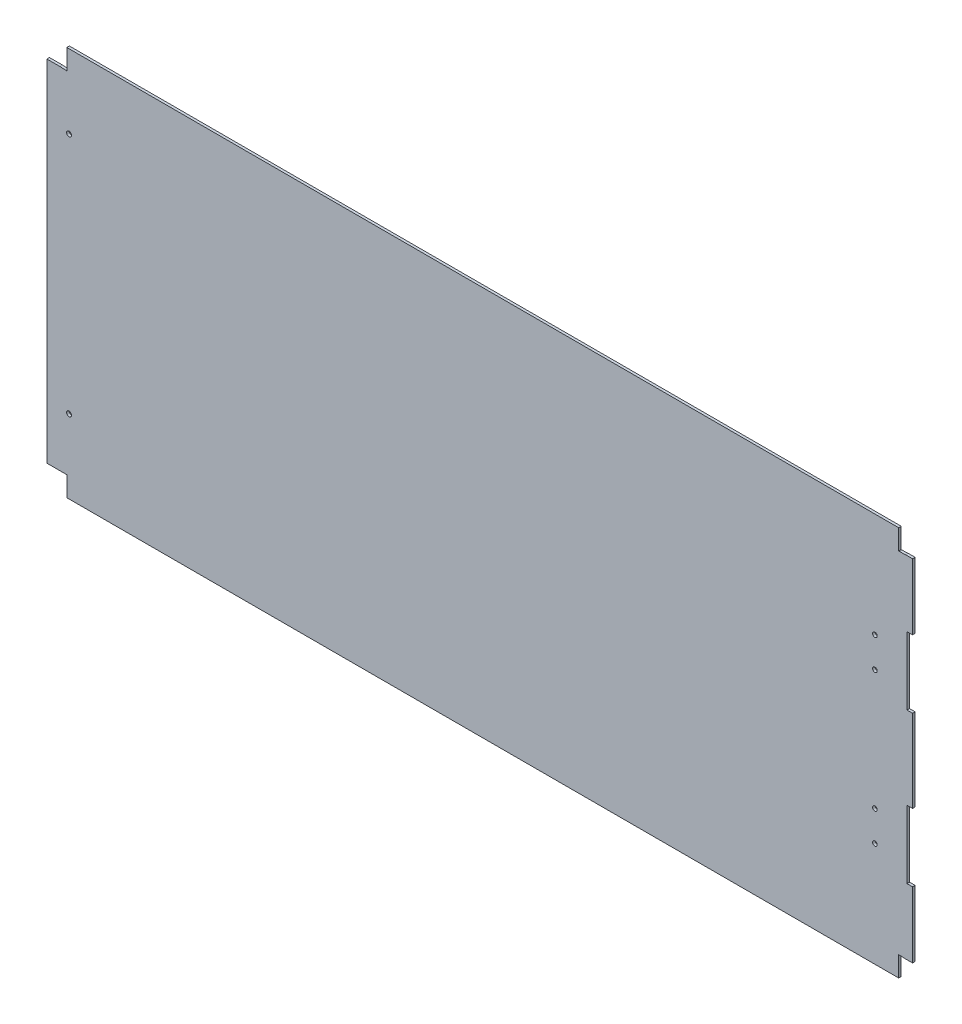
ISO-10303-21;
HEADER;
FILE_DESCRIPTION(('STEP AP214'),'2;1');
FILE_NAME('part.step','',(''),(''),'','','');
FILE_SCHEMA(('AUTOMOTIVE_DESIGN { 1 0 10303 214 1 1 1 1 }'));
ENDSEC;
DATA;
#1=APPLICATION_CONTEXT('core data for automotive mechanical design processes');
#2=APPLICATION_PROTOCOL_DEFINITION('international standard','automotive_design',2000,#1);
#3=PRODUCT_CONTEXT('',#1,'mechanical');
#4=PRODUCT('Part','Part','',(#3));
#5=PRODUCT_RELATED_PRODUCT_CATEGORY('part','',(#4));
#6=PRODUCT_DEFINITION_FORMATION('','',#4);
#7=PRODUCT_DEFINITION_CONTEXT('part definition',#1,'design');
#8=PRODUCT_DEFINITION('design','',#6,#7);
#9=PRODUCT_DEFINITION_SHAPE('','',#8);
#10=(LENGTH_UNIT() NAMED_UNIT(*) SI_UNIT(.MILLI.,.METRE.));
#11=(NAMED_UNIT(*) PLANE_ANGLE_UNIT() SI_UNIT($,.RADIAN.));
#12=(NAMED_UNIT(*) SI_UNIT($,.STERADIAN.) SOLID_ANGLE_UNIT());
#13=UNCERTAINTY_MEASURE_WITH_UNIT(LENGTH_MEASURE(1.E-05),#10,'distance_accuracy_value','');
#14=(GEOMETRIC_REPRESENTATION_CONTEXT(3) GLOBAL_UNCERTAINTY_ASSIGNED_CONTEXT((#13)) GLOBAL_UNIT_ASSIGNED_CONTEXT((#10,
#11,#12)) REPRESENTATION_CONTEXT('',''));
#15=CARTESIAN_POINT('',(0.,0.,0.));
#16=DIRECTION('',(0.,0.,1.));
#17=DIRECTION('',(1.,0.,0.));
#18=AXIS2_PLACEMENT_3D('',#15,#16,#17);
#19=CARTESIAN_POINT('',(0.,0.,-2.667));
#20=DIRECTION('',(0.,0.,-1.));
#21=DIRECTION('',(-1.,0.,0.));
#22=AXIS2_PLACEMENT_3D('',#19,#20,#21);
#23=PLANE('',#22);
#24=CARTESIAN_POINT('',(-433.451,-127.,-2.66700000000005));
#25=DIRECTION('',(0.,0.,1.));
#26=DIRECTION('',(1.,0.,0.));
#27=AXIS2_PLACEMENT_3D('',#24,#25,#26);
#28=CIRCLE('',#27,2.54000000000001);
#29=CARTESIAN_POINT('',(-430.911,-127.,-2.66700000000005));
#30=VERTEX_POINT('',#29);
#31=EDGE_CURVE('E539',#30,#30,#28,.T.);
#32=ORIENTED_EDGE('',*,*,#31,.T.);
#33=EDGE_LOOP('',(#32));
#34=FACE_BOUND('',#33,.T.);
#35=CARTESIAN_POINT('',(410.845,62.992,-2.66700000000005));
#36=DIRECTION('',(0.,0.,1.));
#37=DIRECTION('',(1.,0.,0.));
#38=AXIS2_PLACEMENT_3D('',#35,#36,#37);
#39=CIRCLE('',#38,2.41299999999999);
#40=CARTESIAN_POINT('',(413.258,62.992,-2.66700000000005));
#41=VERTEX_POINT('',#40);
#42=EDGE_CURVE('E567',#41,#41,#39,.T.);
#43=ORIENTED_EDGE('',*,*,#42,.T.);
#44=EDGE_LOOP('',(#43));
#45=FACE_BOUND('',#44,.T.);
#46=CARTESIAN_POINT('',(410.845,-62.9920000000001,-2.66700000000005));
#47=DIRECTION('',(0.,0.,1.));
#48=DIRECTION('',(1.,0.,0.));
#49=AXIS2_PLACEMENT_3D('',#46,#47,#48);
#50=CIRCLE('',#49,2.41299999999999);
#51=CARTESIAN_POINT('',(413.258,-62.9920000000001,-2.66700000000005));
#52=VERTEX_POINT('',#51);
#53=EDGE_CURVE('E548',#52,#52,#50,.T.);
#54=ORIENTED_EDGE('',*,*,#53,.T.);
#55=EDGE_LOOP('',(#54));
#56=FACE_BOUND('',#55,.T.);
#57=CARTESIAN_POINT('',(410.845,-94.7420000000001,-2.66700000000005));
#58=DIRECTION('',(0.,0.,1.));
#59=DIRECTION('',(1.,0.,0.));
#60=AXIS2_PLACEMENT_3D('',#57,#58,#59);
#61=CIRCLE('',#60,2.41299999999999);
#62=CARTESIAN_POINT('',(413.258,-94.7420000000001,-2.66700000000005));
#63=VERTEX_POINT('',#62);
#64=EDGE_CURVE('E549',#63,#63,#61,.T.);
#65=ORIENTED_EDGE('',*,*,#64,.T.);
#66=EDGE_LOOP('',(#65));
#67=FACE_BOUND('',#66,.T.);
#68=CARTESIAN_POINT('',(-433.451,127.,-2.66700000000005));
#69=DIRECTION('',(0.,0.,1.));
#70=DIRECTION('',(1.,0.,0.));
#71=AXIS2_PLACEMENT_3D('',#68,#69,#70);
#72=CIRCLE('',#71,2.54000000000001);
#73=CARTESIAN_POINT('',(-430.911,127.,-2.66700000000005));
#74=VERTEX_POINT('',#73);
#75=EDGE_CURVE('E557',#74,#74,#72,.T.);
#76=ORIENTED_EDGE('',*,*,#75,.T.);
#77=EDGE_LOOP('',(#76));
#78=FACE_BOUND('',#77,.T.);
#79=CARTESIAN_POINT('',(410.845,94.742,-2.66700000000005));
#80=DIRECTION('',(0.,0.,1.));
#81=DIRECTION('',(1.,0.,0.));
#82=AXIS2_PLACEMENT_3D('',#79,#80,#81);
#83=CIRCLE('',#82,2.41299999999999);
#84=CARTESIAN_POINT('',(413.258,94.742,-2.66700000000005));
#85=VERTEX_POINT('',#84);
#86=EDGE_CURVE('E584',#85,#85,#83,.T.);
#87=ORIENTED_EDGE('',*,*,#86,.T.);
#88=EDGE_LOOP('',(#87));
#89=FACE_BOUND('',#88,.T.);
#90=DIRECTION('',(1.,0.,0.));
#91=VECTOR('',#90,1.);
#92=CARTESIAN_POINT('',(0.,183.0705,-2.667));
#93=LINE('',#92,#91);
#94=CARTESIAN_POINT('',(435.737,183.0705,-2.667));
#95=VERTEX_POINT('',#94);
#96=CARTESIAN_POINT('',(436.753,183.0705,-2.66699999999994));
#97=VERTEX_POINT('',#96);
#98=EDGE_CURVE('E588',#95,#97,#93,.T.);
#99=ORIENTED_EDGE('',*,*,#98,.T.);
#100=DIRECTION('',(0.998673606846103,0.0514881247375996,0.));
#101=VECTOR('',#100,1.);
#102=CARTESIAN_POINT('',(436.753,183.0705,-2.66699999999997));
#103=LINE('',#102,#101);
#104=CARTESIAN_POINT('',(442.911291291236,183.388,-2.66699999999997));
#105=VERTEX_POINT('',#104);
#106=EDGE_CURVE('E532',#97,#105,#103,.T.);
#107=ORIENTED_EDGE('',*,*,#106,.T.);
#108=DIRECTION('',(1.,0.,0.));
#109=VECTOR('',#108,1.);
#110=CARTESIAN_POINT('',(440.244291291239,183.388,-2.66699999999992));
#111=LINE('',#110,#109);
#112=CARTESIAN_POINT('',(450.277291291236,183.388,-2.66699999999992));
#113=VERTEX_POINT('',#112);
#114=EDGE_CURVE('E463',#105,#113,#111,.T.);
#115=ORIENTED_EDGE('',*,*,#114,.T.);
#116=DIRECTION('',(0.,-1.,0.));
#117=VECTOR('',#116,1.);
#118=CARTESIAN_POINT('',(450.277291291236,0.,-2.66699999999997));
#119=LINE('',#118,#117);
#120=CARTESIAN_POINT('',(450.277291291236,114.3,-2.66699999999997));
#121=VERTEX_POINT('',#120);
#122=EDGE_CURVE('E459',#113,#121,#119,.T.);
#123=ORIENTED_EDGE('',*,*,#122,.T.);
#124=DIRECTION('',(1.,0.,0.));
#125=VECTOR('',#124,1.);
#126=CARTESIAN_POINT('',(450.277291291238,114.3,-2.66700000000003));
#127=LINE('',#126,#125);
#128=CARTESIAN_POINT('',(444.435291291238,114.3,-2.66699999999992));
#129=VERTEX_POINT('',#128);
#130=EDGE_CURVE('E495',#129,#121,#127,.T.);
#131=ORIENTED_EDGE('',*,*,#130,.F.);
#132=DIRECTION('',(0.,1.,0.));
#133=VECTOR('',#132,1.);
#134=CARTESIAN_POINT('',(444.435291291238,114.3,-2.66699999999992));
#135=LINE('',#134,#133);
#136=CARTESIAN_POINT('',(444.435291291238,43.1799999999999,-2.66699999999992));
#137=VERTEX_POINT('',#136);
#138=EDGE_CURVE('E471',#137,#129,#135,.T.);
#139=ORIENTED_EDGE('',*,*,#138,.F.);
#140=DIRECTION('',(-1.,0.,0.));
#141=VECTOR('',#140,1.);
#142=CARTESIAN_POINT('',(450.277291291238,43.1799999999999,-2.66700000000003));
#143=LINE('',#142,#141);
#144=CARTESIAN_POINT('',(450.277291291238,43.1799999999999,-2.66700000000003));
#145=VERTEX_POINT('',#144);
#146=EDGE_CURVE('E478',#145,#137,#143,.T.);
#147=ORIENTED_EDGE('',*,*,#146,.F.);
#148=CARTESIAN_POINT('',(450.277291291236,-43.1800000000002,-2.66699999999997));
#149=VERTEX_POINT('',#148);
#150=EDGE_CURVE('E465',#145,#149,#119,.T.);
#151=ORIENTED_EDGE('',*,*,#150,.T.);
#152=DIRECTION('',(1.,0.,0.));
#153=VECTOR('',#152,1.);
#154=CARTESIAN_POINT('',(450.277291291238,-43.1800000000002,-2.66700000000003));
#155=LINE('',#154,#153);
#156=CARTESIAN_POINT('',(444.435291291238,-43.1800000000002,-2.66699999999992));
#157=VERTEX_POINT('',#156);
#158=EDGE_CURVE('E497',#157,#149,#155,.T.);
#159=ORIENTED_EDGE('',*,*,#158,.F.);
#160=DIRECTION('',(0.,1.,0.));
#161=VECTOR('',#160,1.);
#162=CARTESIAN_POINT('',(444.435291291238,-114.3,-2.66699999999992));
#163=LINE('',#162,#161);
#164=CARTESIAN_POINT('',(444.435291291238,-114.3,-2.66699999999992));
#165=VERTEX_POINT('',#164);
#166=EDGE_CURVE('E503',#165,#157,#163,.T.);
#167=ORIENTED_EDGE('',*,*,#166,.F.);
#168=DIRECTION('',(-1.,0.,0.));
#169=VECTOR('',#168,1.);
#170=CARTESIAN_POINT('',(450.277291291238,-114.3,-2.66700000000003));
#171=LINE('',#170,#169);
#172=CARTESIAN_POINT('',(450.277291291238,-114.3,-2.66700000000003));
#173=VERTEX_POINT('',#172);
#174=EDGE_CURVE('E510',#173,#165,#171,.T.);
#175=ORIENTED_EDGE('',*,*,#174,.F.);
#176=CARTESIAN_POINT('',(450.277291291236,-183.388,-2.66700000000003));
#177=VERTEX_POINT('',#176);
#178=EDGE_CURVE('E464',#173,#177,#119,.T.);
#179=ORIENTED_EDGE('',*,*,#178,.T.);
#180=DIRECTION('',(-1.,0.,0.));
#181=VECTOR('',#180,1.);
#182=CARTESIAN_POINT('',(440.244291291235,-183.388,-2.66699999999997));
#183=LINE('',#182,#181);
#184=CARTESIAN_POINT('',(442.911291291236,-183.388,-2.66699999999997));
#185=VERTEX_POINT('',#184);
#186=EDGE_CURVE('E468',#177,#185,#183,.T.);
#187=ORIENTED_EDGE('',*,*,#186,.T.);
#188=DIRECTION('',(-0.998673606846103,0.0514881247376126,0.));
#189=VECTOR('',#188,1.);
#190=CARTESIAN_POINT('',(442.911291291236,-183.388,-2.66699999999997));
#191=LINE('',#190,#189);
#192=CARTESIAN_POINT('',(436.753,-183.0705,-2.66699999999997));
#193=VERTEX_POINT('',#192);
#194=EDGE_CURVE('E535',#185,#193,#191,.T.);
#195=ORIENTED_EDGE('',*,*,#194,.T.);
#196=DIRECTION('',(-1.,0.,0.));
#197=VECTOR('',#196,1.);
#198=CARTESIAN_POINT('',(0.,-183.0705,-2.667));
#199=LINE('',#198,#197);
#200=CARTESIAN_POINT('',(435.737,-183.0705,-2.667));
#201=VERTEX_POINT('',#200);
#202=EDGE_CURVE('E613',#193,#201,#199,.T.);
#203=ORIENTED_EDGE('',*,*,#202,.T.);
#204=DIRECTION('',(0.,-1.,0.));
#205=VECTOR('',#204,1.);
#206=CARTESIAN_POINT('',(435.737,-189.738,-2.667));
#207=LINE('',#206,#205);
#208=CARTESIAN_POINT('',(435.737,-204.278291291236,-2.66700000000017));
#209=VERTEX_POINT('',#208);
#210=EDGE_CURVE('E610',#201,#209,#207,.T.);
#211=ORIENTED_EDGE('',*,*,#210,.T.);
#212=DIRECTION('',(1.,0.,0.));
#213=VECTOR('',#212,1.);
#214=CARTESIAN_POINT('',(435.737,-204.278291291236,-2.66700000000017));
#215=LINE('',#214,#213);
#216=CARTESIAN_POINT('',(-435.737,-204.278291291236,-2.6670000000002));
#217=VERTEX_POINT('',#216);
#218=EDGE_CURVE('E385',#217,#209,#215,.T.);
#219=ORIENTED_EDGE('',*,*,#218,.F.);
#220=DIRECTION('',(0.,-1.,0.));
#221=VECTOR('',#220,1.);
#222=CARTESIAN_POINT('',(-435.737,-204.278291291236,-2.6670000000002));
#223=LINE('',#222,#221);
#224=CARTESIAN_POINT('',(-435.737,-190.562291291236,-2.66700000000003));
#225=VERTEX_POINT('',#224);
#226=EDGE_CURVE('E393',#225,#217,#223,.T.);
#227=ORIENTED_EDGE('',*,*,#226,.F.);
#228=DIRECTION('',(0.0514881247375764,0.998673606846105,0.));
#229=VECTOR('',#228,1.);
#230=CARTESIAN_POINT('',(-435.737,-190.562291291236,-2.667));
#231=LINE('',#230,#229);
#232=CARTESIAN_POINT('',(-435.4195,-184.404,-2.667));
#233=VERTEX_POINT('',#232);
#234=EDGE_CURVE('E414',#225,#233,#231,.T.);
#235=ORIENTED_EDGE('',*,*,#234,.T.);
#236=DIRECTION('',(0.,1.,0.));
#237=VECTOR('',#236,1.);
#238=CARTESIAN_POINT('',(-435.4195,0.,-2.667));
#239=LINE('',#238,#237);
#240=CARTESIAN_POINT('',(-435.4195,-183.388,-2.667));
#241=VERTEX_POINT('',#240);
#242=EDGE_CURVE('E605',#233,#241,#239,.T.);
#243=ORIENTED_EDGE('',*,*,#242,.T.);
#244=DIRECTION('',(-1.,0.,0.));
#245=VECTOR('',#244,1.);
#246=CARTESIAN_POINT('',(-442.087,-183.388,-2.667));
#247=LINE('',#246,#245);
#248=CARTESIAN_POINT('',(-456.627291291236,-183.388,-2.66700000000014));
#249=VERTEX_POINT('',#248);
#250=EDGE_CURVE('E602',#241,#249,#247,.T.);
#251=ORIENTED_EDGE('',*,*,#250,.T.);
#252=DIRECTION('',(0.,-1.,0.));
#253=VECTOR('',#252,1.);
#254=CARTESIAN_POINT('',(-456.627291291236,-183.388,-2.66700000000014));
#255=LINE('',#254,#253);
#256=CARTESIAN_POINT('',(-456.627291291236,183.388,-2.66700000000025));
#257=VERTEX_POINT('',#256);
#258=EDGE_CURVE('E344',#257,#249,#255,.T.);
#259=ORIENTED_EDGE('',*,*,#258,.F.);
#260=DIRECTION('',(-1.,0.,0.));
#261=VECTOR('',#260,1.);
#262=CARTESIAN_POINT('',(-456.627291291236,183.388,-2.66700000000025));
#263=LINE('',#262,#261);
#264=CARTESIAN_POINT('',(-442.911291291236,183.388,-2.66700000000014));
#265=VERTEX_POINT('',#264);
#266=EDGE_CURVE('E361',#265,#257,#263,.T.);
#267=ORIENTED_EDGE('',*,*,#266,.F.);
#268=DIRECTION('',(0.998673606846104,-0.0514881247375812,0.));
#269=VECTOR('',#268,1.);
#270=CARTESIAN_POINT('',(-442.911291291236,183.388,-2.66700000000005));
#271=LINE('',#270,#269);
#272=CARTESIAN_POINT('',(-436.753,183.0705,-2.66700000000005));
#273=VERTEX_POINT('',#272);
#274=EDGE_CURVE('E382',#265,#273,#271,.T.);
#275=ORIENTED_EDGE('',*,*,#274,.T.);
#276=DIRECTION('',(1.,0.,0.));
#277=VECTOR('',#276,1.);
#278=CARTESIAN_POINT('',(0.,183.0705,-2.667));
#279=LINE('',#278,#277);
#280=CARTESIAN_POINT('',(-435.737,183.0705,-2.667));
#281=VERTEX_POINT('',#280);
#282=EDGE_CURVE('E598',#273,#281,#279,.T.);
#283=ORIENTED_EDGE('',*,*,#282,.T.);
#284=DIRECTION('',(0.,1.,0.));
#285=VECTOR('',#284,1.);
#286=CARTESIAN_POINT('',(-435.737,189.738,-2.667));
#287=LINE('',#286,#285);
#288=CARTESIAN_POINT('',(-435.737,204.278291291236,-2.66700000000014));
#289=VERTEX_POINT('',#288);
#290=EDGE_CURVE('E334',#281,#289,#287,.T.);
#291=ORIENTED_EDGE('',*,*,#290,.T.);
#292=DIRECTION('',(-1.,0.,0.));
#293=VECTOR('',#292,1.);
#294=CARTESIAN_POINT('',(-435.737,204.278291291236,-2.66700000000014));
#295=LINE('',#294,#293);
#296=CARTESIAN_POINT('',(435.737,204.278291291236,-2.66700000000009));
#297=VERTEX_POINT('',#296);
#298=EDGE_CURVE('E340',#297,#289,#295,.T.);
#299=ORIENTED_EDGE('',*,*,#298,.F.);
#300=DIRECTION('',(0.,-1.,0.));
#301=VECTOR('',#300,1.);
#302=CARTESIAN_POINT('',(435.737,189.738,-2.667));
#303=LINE('',#302,#301);
#304=EDGE_CURVE('E322',#297,#95,#303,.T.);
#305=ORIENTED_EDGE('',*,*,#304,.T.);
#306=EDGE_LOOP('',(#99,#107,#115,#123,#131,#139,#147,#151,#159,#167,#175,#179,#187,#195,#203,
#211,#219,#227,#235,#243,#251,#259,#267,#275,#283,#291,#299,#305));
#307=FACE_BOUND('',#306,.T.);
#308=ADVANCED_FACE('F135',(#34,#45,#56,#67,#78,#89,#307),#23,.T.);
#309=CARTESIAN_POINT('',(0.,0.,0.));
#310=DIRECTION('',(0.,0.,-1.));
#311=DIRECTION('',(-1.,0.,0.));
#312=AXIS2_PLACEMENT_3D('',#309,#310,#311);
#313=PLANE('',#312);
#314=CARTESIAN_POINT('',(-433.451,-127.,0.));
#315=DIRECTION('',(0.,0.,1.));
#316=DIRECTION('',(1.,0.,0.));
#317=AXIS2_PLACEMENT_3D('',#314,#315,#316);
#318=CIRCLE('',#317,2.54000000000001);
#319=CARTESIAN_POINT('',(-430.911,-127.,0.));
#320=VERTEX_POINT('',#319);
#321=EDGE_CURVE('E561',#320,#320,#318,.T.);
#322=ORIENTED_EDGE('',*,*,#321,.F.);
#323=EDGE_LOOP('',(#322));
#324=FACE_BOUND('',#323,.T.);
#325=CARTESIAN_POINT('',(410.845,62.992,0.));
#326=DIRECTION('',(0.,0.,1.));
#327=DIRECTION('',(1.,0.,0.));
#328=AXIS2_PLACEMENT_3D('',#325,#326,#327);
#329=CIRCLE('',#328,2.41299999999999);
#330=CARTESIAN_POINT('',(413.258,62.992,0.));
#331=VERTEX_POINT('',#330);
#332=EDGE_CURVE('E562',#331,#331,#329,.T.);
#333=ORIENTED_EDGE('',*,*,#332,.F.);
#334=EDGE_LOOP('',(#333));
#335=FACE_BOUND('',#334,.T.);
#336=CARTESIAN_POINT('',(410.845,-62.9920000000001,0.));
#337=DIRECTION('',(0.,0.,1.));
#338=DIRECTION('',(1.,0.,0.));
#339=AXIS2_PLACEMENT_3D('',#336,#337,#338);
#340=CIRCLE('',#339,2.41299999999999);
#341=CARTESIAN_POINT('',(413.258,-62.9920000000001,0.));
#342=VERTEX_POINT('',#341);
#343=EDGE_CURVE('E571',#342,#342,#340,.T.);
#344=ORIENTED_EDGE('',*,*,#343,.F.);
#345=EDGE_LOOP('',(#344));
#346=FACE_BOUND('',#345,.T.);
#347=CARTESIAN_POINT('',(410.845,-94.7420000000001,0.));
#348=DIRECTION('',(0.,0.,1.));
#349=DIRECTION('',(1.,0.,0.));
#350=AXIS2_PLACEMENT_3D('',#347,#348,#349);
#351=CIRCLE('',#350,2.41299999999999);
#352=CARTESIAN_POINT('',(413.258,-94.7420000000001,0.));
#353=VERTEX_POINT('',#352);
#354=EDGE_CURVE('E544',#353,#353,#351,.T.);
#355=ORIENTED_EDGE('',*,*,#354,.F.);
#356=EDGE_LOOP('',(#355));
#357=FACE_BOUND('',#356,.T.);
#358=CARTESIAN_POINT('',(-433.451,127.,0.));
#359=DIRECTION('',(0.,0.,1.));
#360=DIRECTION('',(1.,0.,0.));
#361=AXIS2_PLACEMENT_3D('',#358,#359,#360);
#362=CIRCLE('',#361,2.54000000000001);
#363=CARTESIAN_POINT('',(-430.911,127.,0.));
#364=VERTEX_POINT('',#363);
#365=EDGE_CURVE('E553',#364,#364,#362,.T.);
#366=ORIENTED_EDGE('',*,*,#365,.F.);
#367=EDGE_LOOP('',(#366));
#368=FACE_BOUND('',#367,.T.);
#369=CARTESIAN_POINT('',(410.845,94.742,0.));
#370=DIRECTION('',(0.,0.,1.));
#371=DIRECTION('',(1.,0.,0.));
#372=AXIS2_PLACEMENT_3D('',#369,#370,#371);
#373=CIRCLE('',#372,2.41299999999999);
#374=CARTESIAN_POINT('',(413.258,94.742,0.));
#375=VERTEX_POINT('',#374);
#376=EDGE_CURVE('E566',#375,#375,#373,.T.);
#377=ORIENTED_EDGE('',*,*,#376,.F.);
#378=EDGE_LOOP('',(#377));
#379=FACE_BOUND('',#378,.T.);
#380=DIRECTION('',(-1.,0.,0.));
#381=VECTOR('',#380,1.);
#382=CARTESIAN_POINT('',(437.0705,-183.0705,0.));
#383=LINE('',#382,#381);
#384=CARTESIAN_POINT('',(436.753,-183.0705,0.));
#385=VERTEX_POINT('',#384);
#386=CARTESIAN_POINT('',(435.737,-183.0705,0.));
#387=VERTEX_POINT('',#386);
#388=EDGE_CURVE('E630',#385,#387,#383,.T.);
#389=ORIENTED_EDGE('',*,*,#388,.F.);
#390=DIRECTION('',(-0.998673606846103,0.0514881247376126,0.));
#391=VECTOR('',#390,1.);
#392=CARTESIAN_POINT('',(442.911291291236,-183.388,0.));
#393=LINE('',#392,#391);
#394=CARTESIAN_POINT('',(442.911291291236,-183.388,0.));
#395=VERTEX_POINT('',#394);
#396=EDGE_CURVE('E536',#395,#385,#393,.T.);
#397=ORIENTED_EDGE('',*,*,#396,.F.);
#398=DIRECTION('',(1.,0.,0.));
#399=VECTOR('',#398,1.);
#400=CARTESIAN_POINT('',(440.244291291236,-183.388,0.));
#401=LINE('',#400,#399);
#402=CARTESIAN_POINT('',(450.277291291236,-183.388,0.));
#403=VERTEX_POINT('',#402);
#404=EDGE_CURVE('E420',#403,#395,#401,.F.);
#405=ORIENTED_EDGE('',*,*,#404,.F.);
#406=DIRECTION('',(0.,1.,0.));
#407=VECTOR('',#406,1.);
#408=CARTESIAN_POINT('',(450.277291291236,-183.388,0.));
#409=LINE('',#408,#407);
#410=CARTESIAN_POINT('',(450.277291291236,-114.3,0.));
#411=VERTEX_POINT('',#410);
#412=EDGE_CURVE('E496',#411,#403,#409,.F.);
#413=ORIENTED_EDGE('',*,*,#412,.F.);
#414=DIRECTION('',(-1.,0.,0.));
#415=VECTOR('',#414,1.);
#416=CARTESIAN_POINT('',(450.277291291243,-114.3,0.));
#417=LINE('',#416,#415);
#418=CARTESIAN_POINT('',(444.435291291238,-114.3,1.66533453693773E-13));
#419=VERTEX_POINT('',#418);
#420=EDGE_CURVE('E440',#411,#419,#417,.T.);
#421=ORIENTED_EDGE('',*,*,#420,.T.);
#422=DIRECTION('',(0.,1.,0.));
#423=VECTOR('',#422,1.);
#424=CARTESIAN_POINT('',(444.435291291238,-114.3,0.));
#425=LINE('',#424,#423);
#426=CARTESIAN_POINT('',(444.435291291238,-43.1800000000002,0.));
#427=VERTEX_POINT('',#426);
#428=EDGE_CURVE('E436',#419,#427,#425,.T.);
#429=ORIENTED_EDGE('',*,*,#428,.T.);
#430=DIRECTION('',(1.,0.,0.));
#431=VECTOR('',#430,1.);
#432=CARTESIAN_POINT('',(450.277291291243,-43.1800000000002,0.));
#433=LINE('',#432,#431);
#434=CARTESIAN_POINT('',(450.277291291236,-43.1800000000002,0.));
#435=VERTEX_POINT('',#434);
#436=EDGE_CURVE('E432',#427,#435,#433,.T.);
#437=ORIENTED_EDGE('',*,*,#436,.T.);
#438=CARTESIAN_POINT('',(450.277291291236,43.1799999999999,0.));
#439=VERTEX_POINT('',#438);
#440=EDGE_CURVE('E489',#439,#435,#409,.F.);
#441=ORIENTED_EDGE('',*,*,#440,.F.);
#442=DIRECTION('',(-1.,0.,0.));
#443=VECTOR('',#442,1.);
#444=CARTESIAN_POINT('',(450.277291291243,43.1799999999999,0.));
#445=LINE('',#444,#443);
#446=CARTESIAN_POINT('',(444.435291291238,43.1799999999999,1.66533453693773E-13));
#447=VERTEX_POINT('',#446);
#448=EDGE_CURVE('E452',#439,#447,#445,.T.);
#449=ORIENTED_EDGE('',*,*,#448,.T.);
#450=DIRECTION('',(0.,1.,0.));
#451=VECTOR('',#450,1.);
#452=CARTESIAN_POINT('',(444.435291291238,114.3,0.));
#453=LINE('',#452,#451);
#454=CARTESIAN_POINT('',(444.435291291238,114.3,0.));
#455=VERTEX_POINT('',#454);
#456=EDGE_CURVE('E448',#447,#455,#453,.T.);
#457=ORIENTED_EDGE('',*,*,#456,.T.);
#458=DIRECTION('',(1.,0.,0.));
#459=VECTOR('',#458,1.);
#460=CARTESIAN_POINT('',(450.277291291243,114.3,0.));
#461=LINE('',#460,#459);
#462=CARTESIAN_POINT('',(450.277291291236,114.3,0.));
#463=VERTEX_POINT('',#462);
#464=EDGE_CURVE('E444',#455,#463,#461,.T.);
#465=ORIENTED_EDGE('',*,*,#464,.T.);
#466=CARTESIAN_POINT('',(450.277291291236,183.388,0.));
#467=VERTEX_POINT('',#466);
#468=EDGE_CURVE('E490',#467,#463,#409,.F.);
#469=ORIENTED_EDGE('',*,*,#468,.F.);
#470=DIRECTION('',(-1.,0.,0.));
#471=VECTOR('',#470,1.);
#472=CARTESIAN_POINT('',(450.277291291236,183.388,0.));
#473=LINE('',#472,#471);
#474=CARTESIAN_POINT('',(442.911291291236,183.388,1.11022302462516E-13));
#475=VERTEX_POINT('',#474);
#476=EDGE_CURVE('E456',#475,#467,#473,.F.);
#477=ORIENTED_EDGE('',*,*,#476,.F.);
#478=DIRECTION('',(0.998673606846103,0.0514881247375996,0.));
#479=VECTOR('',#478,1.);
#480=CARTESIAN_POINT('',(436.753,183.0705,0.));
#481=LINE('',#480,#479);
#482=CARTESIAN_POINT('',(436.753,183.0705,0.));
#483=VERTEX_POINT('',#482);
#484=EDGE_CURVE('E423',#483,#475,#481,.T.);
#485=ORIENTED_EDGE('',*,*,#484,.F.);
#486=DIRECTION('',(1.,0.,0.));
#487=VECTOR('',#486,1.);
#488=CARTESIAN_POINT('',(435.737,183.0705,0.));
#489=LINE('',#488,#487);
#490=CARTESIAN_POINT('',(435.737,183.0705,0.));
#491=VERTEX_POINT('',#490);
#492=EDGE_CURVE('E333',#491,#483,#489,.T.);
#493=ORIENTED_EDGE('',*,*,#492,.F.);
#494=DIRECTION('',(0.,-1.,0.));
#495=VECTOR('',#494,1.);
#496=CARTESIAN_POINT('',(435.737,189.738,0.));
#497=LINE('',#496,#495);
#498=CARTESIAN_POINT('',(435.737,204.278291291236,0.));
#499=VERTEX_POINT('',#498);
#500=EDGE_CURVE('E595',#499,#491,#497,.T.);
#501=ORIENTED_EDGE('',*,*,#500,.F.);
#502=DIRECTION('',(1.,0.,0.));
#503=VECTOR('',#502,1.);
#504=CARTESIAN_POINT('',(0.,204.278291291236,-1.11022302462516E-13));
#505=LINE('',#504,#503);
#506=CARTESIAN_POINT('',(-435.737,204.278291291236,-1.38777878078145E-13));
#507=VERTEX_POINT('',#506);
#508=EDGE_CURVE('E342',#499,#507,#505,.F.);
#509=ORIENTED_EDGE('',*,*,#508,.T.);
#510=DIRECTION('',(0.,1.,0.));
#511=VECTOR('',#510,1.);
#512=CARTESIAN_POINT('',(-435.737,189.738,0.));
#513=LINE('',#512,#511);
#514=CARTESIAN_POINT('',(-435.737,183.0705,0.));
#515=VERTEX_POINT('',#514);
#516=EDGE_CURVE('E592',#515,#507,#513,.T.);
#517=ORIENTED_EDGE('',*,*,#516,.F.);
#518=DIRECTION('',(1.,0.,0.));
#519=VECTOR('',#518,1.);
#520=CARTESIAN_POINT('',(-437.0705,183.0705,0.));
#521=LINE('',#520,#519);
#522=CARTESIAN_POINT('',(-436.753,183.0705,0.));
#523=VERTEX_POINT('',#522);
#524=EDGE_CURVE('E151',#523,#515,#521,.T.);
#525=ORIENTED_EDGE('',*,*,#524,.F.);
#526=DIRECTION('',(0.998673606846104,-0.0514881247375812,0.));
#527=VECTOR('',#526,1.);
#528=CARTESIAN_POINT('',(-442.911291291236,183.388,0.));
#529=LINE('',#528,#527);
#530=CARTESIAN_POINT('',(-442.911291291236,183.388,-1.66533453693773E-13));
#531=VERTEX_POINT('',#530);
#532=EDGE_CURVE('E360',#531,#523,#529,.T.);
#533=ORIENTED_EDGE('',*,*,#532,.F.);
#534=DIRECTION('',(1.,0.,0.));
#535=VECTOR('',#534,1.);
#536=CARTESIAN_POINT('',(-440.244291291234,183.388,-1.66533453693773E-13));
#537=LINE('',#536,#535);
#538=CARTESIAN_POINT('',(-456.627291291236,183.388,-2.77555756156289E-13));
#539=VERTEX_POINT('',#538);
#540=EDGE_CURVE('E372',#531,#539,#537,.F.);
#541=ORIENTED_EDGE('',*,*,#540,.T.);
#542=DIRECTION('',(0.,1.,0.));
#543=VECTOR('',#542,1.);
#544=CARTESIAN_POINT('',(-456.627291291236,-1.33011484252183E-13,-2.22044604925031E-13));
#545=LINE('',#544,#543);
#546=CARTESIAN_POINT('',(-456.627291291236,-183.388,-1.66533453693773E-13));
#547=VERTEX_POINT('',#546);
#548=EDGE_CURVE('E368',#539,#547,#545,.F.);
#549=ORIENTED_EDGE('',*,*,#548,.T.);
#550=DIRECTION('',(-1.,0.,0.));
#551=VECTOR('',#550,1.);
#552=CARTESIAN_POINT('',(-442.087,-183.388,0.));
#553=LINE('',#552,#551);
#554=CARTESIAN_POINT('',(-435.4195,-183.388,0.));
#555=VERTEX_POINT('',#554);
#556=EDGE_CURVE('E606',#555,#547,#553,.T.);
#557=ORIENTED_EDGE('',*,*,#556,.F.);
#558=DIRECTION('',(0.,1.,0.));
#559=VECTOR('',#558,1.);
#560=CARTESIAN_POINT('',(-435.4195,-184.7215,0.));
#561=LINE('',#560,#559);
#562=CARTESIAN_POINT('',(-435.4195,-184.404,0.));
#563=VERTEX_POINT('',#562);
#564=EDGE_CURVE('E158',#563,#555,#561,.T.);
#565=ORIENTED_EDGE('',*,*,#564,.F.);
#566=DIRECTION('',(0.0514881247375764,0.998673606846105,0.));
#567=VECTOR('',#566,1.);
#568=CARTESIAN_POINT('',(-435.737,-190.562291291236,0.));
#569=LINE('',#568,#567);
#570=CARTESIAN_POINT('',(-435.737,-190.562291291236,0.));
#571=VERTEX_POINT('',#570);
#572=EDGE_CURVE('E392',#571,#563,#569,.T.);
#573=ORIENTED_EDGE('',*,*,#572,.F.);
#574=DIRECTION('',(0.,1.,0.));
#575=VECTOR('',#574,1.);
#576=CARTESIAN_POINT('',(-435.737,-187.895291291234,0.));
#577=LINE('',#576,#575);
#578=CARTESIAN_POINT('',(-435.737,-204.278291291236,-1.94289029309402E-13));
#579=VERTEX_POINT('',#578);
#580=EDGE_CURVE('E404',#571,#579,#577,.F.);
#581=ORIENTED_EDGE('',*,*,#580,.T.);
#582=DIRECTION('',(-1.,0.,0.));
#583=VECTOR('',#582,1.);
#584=CARTESIAN_POINT('',(0.,-204.278291291236,-1.66533453693773E-13));
#585=LINE('',#584,#583);
#586=CARTESIAN_POINT('',(435.737,-204.278291291236,-1.38777878078145E-13));
#587=VERTEX_POINT('',#586);
#588=EDGE_CURVE('E400',#579,#587,#585,.F.);
#589=ORIENTED_EDGE('',*,*,#588,.T.);
#590=DIRECTION('',(0.,-1.,0.));
#591=VECTOR('',#590,1.);
#592=CARTESIAN_POINT('',(435.737,-189.738,0.));
#593=LINE('',#592,#591);
#594=EDGE_CURVE('E614',#387,#587,#593,.T.);
#595=ORIENTED_EDGE('',*,*,#594,.F.);
#596=EDGE_LOOP('',(#389,#397,#405,#413,#421,#429,#437,#441,#449,#457,#465,#469,#477,#485,#493,
#501,#509,#517,#525,#533,#541,#549,#557,#565,#573,#581,#589,#595));
#597=FACE_BOUND('',#596,.T.);
#598=ADVANCED_FACE('F137',(#324,#335,#346,#357,#368,#379,#597),#313,.F.);
#599=CARTESIAN_POINT('',(435.737,183.0705,0.));
#600=DIRECTION('',(0.,1.,0.));
#601=DIRECTION('',(0.,0.,1.));
#602=AXIS2_PLACEMENT_3D('',#599,#600,#601);
#603=PLANE('',#602);
#604=ORIENTED_EDGE('',*,*,#492,.T.);
#605=DIRECTION('',(0.,0.,-1.));
#606=VECTOR('',#605,1.);
#607=CARTESIAN_POINT('',(436.753,183.0705,0.));
#608=LINE('',#607,#606);
#609=EDGE_CURVE('E627',#483,#97,#608,.T.);
#610=ORIENTED_EDGE('',*,*,#609,.T.);
#611=ORIENTED_EDGE('',*,*,#98,.F.);
#612=DIRECTION('',(0.,0.,-1.));
#613=VECTOR('',#612,1.);
#614=CARTESIAN_POINT('',(435.737,183.0705,0.));
#615=LINE('',#614,#613);
#616=EDGE_CURVE('E328',#491,#95,#615,.T.);
#617=ORIENTED_EDGE('',*,*,#616,.F.);
#618=EDGE_LOOP('',(#604,#610,#611,#617));
#619=FACE_BOUND('',#618,.T.);
#620=ADVANCED_FACE('F739',(#619),#603,.T.);
#621=CARTESIAN_POINT('',(437.0705,-183.0705,0.));
#622=DIRECTION('',(0.,-1.,0.));
#623=DIRECTION('',(0.,0.,-1.));
#624=AXIS2_PLACEMENT_3D('',#621,#622,#623);
#625=PLANE('',#624);
#626=ORIENTED_EDGE('',*,*,#202,.F.);
#627=DIRECTION('',(0.,0.,-1.));
#628=VECTOR('',#627,1.);
#629=CARTESIAN_POINT('',(436.753,-183.0705,0.));
#630=LINE('',#629,#628);
#631=EDGE_CURVE('E650',#385,#193,#630,.T.);
#632=ORIENTED_EDGE('',*,*,#631,.F.);
#633=ORIENTED_EDGE('',*,*,#388,.T.);
#634=DIRECTION('',(0.,0.,-1.));
#635=VECTOR('',#634,1.);
#636=CARTESIAN_POINT('',(435.737,-183.0705,0.));
#637=LINE('',#636,#635);
#638=EDGE_CURVE('E617',#387,#201,#637,.T.);
#639=ORIENTED_EDGE('',*,*,#638,.T.);
#640=EDGE_LOOP('',(#626,#632,#633,#639));
#641=FACE_BOUND('',#640,.T.);
#642=ADVANCED_FACE('F679',(#641),#625,.T.);
#643=CARTESIAN_POINT('',(435.737,-189.738,-2.667));
#644=DIRECTION('',(-1.,0.,0.));
#645=DIRECTION('',(0.,0.,1.));
#646=AXIS2_PLACEMENT_3D('',#643,#644,#645);
#647=PLANE('',#646);
#648=ORIENTED_EDGE('',*,*,#594,.T.);
#649=DIRECTION('',(0.,0.,1.));
#650=VECTOR('',#649,1.);
#651=CARTESIAN_POINT('',(435.737,-204.278291291236,-2.66700000000014));
#652=LINE('',#651,#650);
#653=EDGE_CURVE('E407',#209,#587,#652,.T.);
#654=ORIENTED_EDGE('',*,*,#653,.F.);
#655=ORIENTED_EDGE('',*,*,#210,.F.);
#656=ORIENTED_EDGE('',*,*,#638,.F.);
#657=EDGE_LOOP('',(#648,#654,#655,#656));
#658=FACE_BOUND('',#657,.T.);
#659=ADVANCED_FACE('F673',(#658),#647,.F.);
#660=CARTESIAN_POINT('',(-435.4195,-184.7215,0.));
#661=DIRECTION('',(-1.,0.,0.));
#662=DIRECTION('',(0.,0.,1.));
#663=AXIS2_PLACEMENT_3D('',#660,#661,#662);
#664=PLANE('',#663);
#665=ORIENTED_EDGE('',*,*,#242,.F.);
#666=DIRECTION('',(0.,0.,-1.));
#667=VECTOR('',#666,1.);
#668=CARTESIAN_POINT('',(-435.4195,-184.404,0.));
#669=LINE('',#668,#667);
#670=EDGE_CURVE('E144',#563,#233,#669,.T.);
#671=ORIENTED_EDGE('',*,*,#670,.F.);
#672=ORIENTED_EDGE('',*,*,#564,.T.);
#673=DIRECTION('',(0.,0.,-1.));
#674=VECTOR('',#673,1.);
#675=CARTESIAN_POINT('',(-435.4195,-183.388,0.));
#676=LINE('',#675,#674);
#677=EDGE_CURVE('E609',#555,#241,#676,.T.);
#678=ORIENTED_EDGE('',*,*,#677,.T.);
#679=EDGE_LOOP('',(#665,#671,#672,#678));
#680=FACE_BOUND('',#679,.T.);
#681=ADVANCED_FACE('F745',(#680),#664,.T.);
#682=CARTESIAN_POINT('',(-442.087,-183.388,-2.667));
#683=DIRECTION('',(0.,1.,0.));
#684=DIRECTION('',(0.,0.,1.));
#685=AXIS2_PLACEMENT_3D('',#682,#683,#684);
#686=PLANE('',#685);
#687=ORIENTED_EDGE('',*,*,#556,.T.);
#688=DIRECTION('',(0.,0.,1.));
#689=VECTOR('',#688,1.);
#690=CARTESIAN_POINT('',(-456.627291291236,-183.388,-2.66700000000014));
#691=LINE('',#690,#689);
#692=EDGE_CURVE('E375',#249,#547,#691,.T.);
#693=ORIENTED_EDGE('',*,*,#692,.F.);
#694=ORIENTED_EDGE('',*,*,#250,.F.);
#695=ORIENTED_EDGE('',*,*,#677,.F.);
#696=EDGE_LOOP('',(#687,#693,#694,#695));
#697=FACE_BOUND('',#696,.T.);
#698=ADVANCED_FACE('F748',(#697),#686,.F.);
#699=CARTESIAN_POINT('',(-437.0705,183.0705,0.));
#700=DIRECTION('',(0.,1.,0.));
#701=DIRECTION('',(0.,0.,1.));
#702=AXIS2_PLACEMENT_3D('',#699,#700,#701);
#703=PLANE('',#702);
#704=ORIENTED_EDGE('',*,*,#282,.F.);
#705=DIRECTION('',(0.,0.,-1.));
#706=VECTOR('',#705,1.);
#707=CARTESIAN_POINT('',(-436.753,183.0705,0.));
#708=LINE('',#707,#706);
#709=EDGE_CURVE('E13',#523,#273,#708,.T.);
#710=ORIENTED_EDGE('',*,*,#709,.F.);
#711=ORIENTED_EDGE('',*,*,#524,.T.);
#712=DIRECTION('',(0.,0.,-1.));
#713=VECTOR('',#712,1.);
#714=CARTESIAN_POINT('',(-435.737,183.0705,0.));
#715=LINE('',#714,#713);
#716=EDGE_CURVE('E596',#515,#281,#715,.T.);
#717=ORIENTED_EDGE('',*,*,#716,.T.);
#718=EDGE_LOOP('',(#704,#710,#711,#717));
#719=FACE_BOUND('',#718,.T.);
#720=ADVANCED_FACE('F752',(#719),#703,.T.);
#721=CARTESIAN_POINT('',(-435.737,189.738,-2.667));
#722=DIRECTION('',(1.,0.,0.));
#723=DIRECTION('',(0.,0.,-1.));
#724=AXIS2_PLACEMENT_3D('',#721,#722,#723);
#725=PLANE('',#724);
#726=ORIENTED_EDGE('',*,*,#516,.T.);
#727=DIRECTION('',(0.,0.,1.));
#728=VECTOR('',#727,1.);
#729=CARTESIAN_POINT('',(-435.737,204.278291291236,-2.66700000000014));
#730=LINE('',#729,#728);
#731=EDGE_CURVE('E349',#289,#507,#730,.T.);
#732=ORIENTED_EDGE('',*,*,#731,.F.);
#733=ORIENTED_EDGE('',*,*,#290,.F.);
#734=ORIENTED_EDGE('',*,*,#716,.F.);
#735=EDGE_LOOP('',(#726,#732,#733,#734));
#736=FACE_BOUND('',#735,.T.);
#737=ADVANCED_FACE('F755',(#736),#725,.F.);
#738=CARTESIAN_POINT('',(435.737,189.738,-2.667));
#739=DIRECTION('',(-1.,0.,0.));
#740=DIRECTION('',(0.,0.,1.));
#741=AXIS2_PLACEMENT_3D('',#738,#739,#740);
#742=PLANE('',#741);
#743=ORIENTED_EDGE('',*,*,#304,.F.);
#744=DIRECTION('',(0.,0.,1.));
#745=VECTOR('',#744,1.);
#746=CARTESIAN_POINT('',(435.737,204.278291291236,-2.66700000000009));
#747=LINE('',#746,#745);
#748=EDGE_CURVE('E325',#297,#499,#747,.T.);
#749=ORIENTED_EDGE('',*,*,#748,.T.);
#750=ORIENTED_EDGE('',*,*,#500,.T.);
#751=ORIENTED_EDGE('',*,*,#616,.T.);
#752=EDGE_LOOP('',(#743,#749,#750,#751));
#753=FACE_BOUND('',#752,.T.);
#754=ADVANCED_FACE('F324',(#753),#742,.F.);
#755=CARTESIAN_POINT('',(410.845,94.742,-2.66700000000005));
#756=DIRECTION('',(0.,0.,1.));
#757=DIRECTION('',(1.,0.,0.));
#758=AXIS2_PLACEMENT_3D('',#755,#756,#757);
#759=CYLINDRICAL_SURFACE('',#758,2.41299999999999);
#760=ORIENTED_EDGE('',*,*,#86,.F.);
#761=EDGE_LOOP('',(#760));
#762=FACE_BOUND('',#761,.T.);
#763=ORIENTED_EDGE('',*,*,#376,.T.);
#764=EDGE_LOOP('',(#763));
#765=FACE_BOUND('',#764,.T.);
#766=ADVANCED_FACE('F764',(#762,#765),#759,.F.);
#767=CARTESIAN_POINT('',(-433.451,127.,-2.66700000000005));
#768=DIRECTION('',(0.,0.,1.));
#769=DIRECTION('',(1.,0.,0.));
#770=AXIS2_PLACEMENT_3D('',#767,#768,#769);
#771=CYLINDRICAL_SURFACE('',#770,2.54000000000001);
#772=ORIENTED_EDGE('',*,*,#75,.F.);
#773=EDGE_LOOP('',(#772));
#774=FACE_BOUND('',#773,.T.);
#775=ORIENTED_EDGE('',*,*,#365,.T.);
#776=EDGE_LOOP('',(#775));
#777=FACE_BOUND('',#776,.T.);
#778=ADVANCED_FACE('F770',(#774,#777),#771,.F.);
#779=CARTESIAN_POINT('',(410.845,-94.7420000000001,-2.66700000000005));
#780=DIRECTION('',(0.,0.,1.));
#781=DIRECTION('',(1.,0.,0.));
#782=AXIS2_PLACEMENT_3D('',#779,#780,#781);
#783=CYLINDRICAL_SURFACE('',#782,2.41299999999999);
#784=ORIENTED_EDGE('',*,*,#64,.F.);
#785=EDGE_LOOP('',(#784));
#786=FACE_BOUND('',#785,.T.);
#787=ORIENTED_EDGE('',*,*,#354,.T.);
#788=EDGE_LOOP('',(#787));
#789=FACE_BOUND('',#788,.T.);
#790=ADVANCED_FACE('F781',(#786,#789),#783,.F.);
#791=CARTESIAN_POINT('',(410.845,-62.9920000000001,-2.66700000000005));
#792=DIRECTION('',(0.,0.,1.));
#793=DIRECTION('',(1.,0.,0.));
#794=AXIS2_PLACEMENT_3D('',#791,#792,#793);
#795=CYLINDRICAL_SURFACE('',#794,2.41299999999999);
#796=ORIENTED_EDGE('',*,*,#53,.F.);
#797=EDGE_LOOP('',(#796));
#798=FACE_BOUND('',#797,.T.);
#799=ORIENTED_EDGE('',*,*,#343,.T.);
#800=EDGE_LOOP('',(#799));
#801=FACE_BOUND('',#800,.T.);
#802=ADVANCED_FACE('F778',(#798,#801),#795,.F.);
#803=CARTESIAN_POINT('',(410.845,62.992,-2.66700000000005));
#804=DIRECTION('',(0.,0.,1.));
#805=DIRECTION('',(1.,0.,0.));
#806=AXIS2_PLACEMENT_3D('',#803,#804,#805);
#807=CYLINDRICAL_SURFACE('',#806,2.41299999999999);
#808=ORIENTED_EDGE('',*,*,#42,.F.);
#809=EDGE_LOOP('',(#808));
#810=FACE_BOUND('',#809,.T.);
#811=ORIENTED_EDGE('',*,*,#332,.T.);
#812=EDGE_LOOP('',(#811));
#813=FACE_BOUND('',#812,.T.);
#814=ADVANCED_FACE('F776',(#810,#813),#807,.F.);
#815=CARTESIAN_POINT('',(-433.451,-127.,-2.66700000000005));
#816=DIRECTION('',(0.,0.,1.));
#817=DIRECTION('',(1.,0.,0.));
#818=AXIS2_PLACEMENT_3D('',#815,#816,#817);
#819=CYLINDRICAL_SURFACE('',#818,2.54000000000001);
#820=ORIENTED_EDGE('',*,*,#31,.F.);
#821=EDGE_LOOP('',(#820));
#822=FACE_BOUND('',#821,.T.);
#823=ORIENTED_EDGE('',*,*,#321,.T.);
#824=EDGE_LOOP('',(#823));
#825=FACE_BOUND('',#824,.T.);
#826=ADVANCED_FACE('F772',(#822,#825),#819,.F.);
#827=CARTESIAN_POINT('',(436.753,183.0705,-1.41350999999997));
#828=DIRECTION('',(-0.0514881247375996,0.998673606846103,0.));
#829=DIRECTION('',(0.998673606846103,0.0514881247375996,0.));
#830=AXIS2_PLACEMENT_3D('',#827,#828,#829);
#831=PLANE('',#830);
#832=ORIENTED_EDGE('',*,*,#609,.F.);
#833=ORIENTED_EDGE('',*,*,#484,.T.);
#834=DIRECTION('',(0.,0.,-1.));
#835=VECTOR('',#834,1.);
#836=CARTESIAN_POINT('',(442.911291291236,183.388,1.11022302462516E-13));
#837=LINE('',#836,#835);
#838=EDGE_CURVE('E417',#475,#105,#837,.T.);
#839=ORIENTED_EDGE('',*,*,#838,.T.);
#840=ORIENTED_EDGE('',*,*,#106,.F.);
#841=EDGE_LOOP('',(#832,#833,#839,#840));
#842=FACE_BOUND('',#841,.T.);
#843=ADVANCED_FACE('F775',(#842),#831,.T.);
#844=CARTESIAN_POINT('',(442.911291291236,-183.388,-1.41350999999997));
#845=DIRECTION('',(-0.0514881247376126,-0.998673606846103,0.));
#846=DIRECTION('',(-0.998673606846103,0.0514881247376126,0.));
#847=AXIS2_PLACEMENT_3D('',#844,#845,#846);
#848=PLANE('',#847);
#849=ORIENTED_EDGE('',*,*,#396,.T.);
#850=ORIENTED_EDGE('',*,*,#631,.T.);
#851=ORIENTED_EDGE('',*,*,#194,.F.);
#852=DIRECTION('',(0.,0.,-1.));
#853=VECTOR('',#852,1.);
#854=CARTESIAN_POINT('',(442.911291291236,-183.388,-2.66699999999992));
#855=LINE('',#854,#853);
#856=EDGE_CURVE('E428',#395,#185,#855,.T.);
#857=ORIENTED_EDGE('',*,*,#856,.F.);
#858=EDGE_LOOP('',(#849,#850,#851,#857));
#859=FACE_BOUND('',#858,.T.);
#860=ADVANCED_FACE('F683',(#859),#848,.T.);
#861=CARTESIAN_POINT('',(450.277291291246,114.3,881.508));
#862=DIRECTION('',(0.,1.,0.));
#863=DIRECTION('',(1.,0.,0.));
#864=AXIS2_PLACEMENT_3D('',#861,#862,#863);
#865=PLANE('',#864);
#866=DIRECTION('',(0.,0.,-1.));
#867=VECTOR('',#866,1.);
#868=CARTESIAN_POINT('',(444.435291291246,114.3,881.508));
#869=LINE('',#868,#867);
#870=EDGE_CURVE('E526',#455,#129,#869,.T.);
#871=ORIENTED_EDGE('',*,*,#870,.T.);
#872=ORIENTED_EDGE('',*,*,#130,.T.);
#873=DIRECTION('',(0.,0.,-1.));
#874=VECTOR('',#873,1.);
#875=CARTESIAN_POINT('',(450.277291291246,114.3,881.508));
#876=LINE('',#875,#874);
#877=EDGE_CURVE('E494',#463,#121,#876,.T.);
#878=ORIENTED_EDGE('',*,*,#877,.F.);
#879=ORIENTED_EDGE('',*,*,#464,.F.);
#880=EDGE_LOOP('',(#871,#872,#878,#879));
#881=FACE_BOUND('',#880,.T.);
#882=ADVANCED_FACE('F729',(#881),#865,.F.);
#883=CARTESIAN_POINT('',(450.277291291236,-183.388,-2.66699999999997));
#884=DIRECTION('',(-1.,0.,0.));
#885=DIRECTION('',(0.,0.,1.));
#886=AXIS2_PLACEMENT_3D('',#883,#884,#885);
#887=PLANE('',#886);
#888=ORIENTED_EDGE('',*,*,#468,.T.);
#889=ORIENTED_EDGE('',*,*,#877,.T.);
#890=ORIENTED_EDGE('',*,*,#122,.F.);
#891=DIRECTION('',(0.,0.,1.));
#892=VECTOR('',#891,1.);
#893=CARTESIAN_POINT('',(450.277291291236,183.388,-2.66699999999992));
#894=LINE('',#893,#892);
#895=EDGE_CURVE('E517',#113,#467,#894,.T.);
#896=ORIENTED_EDGE('',*,*,#895,.T.);
#897=EDGE_LOOP('',(#888,#889,#890,#896));
#898=FACE_BOUND('',#897,.T.);
#899=ADVANCED_FACE('F721',(#898),#887,.F.);
#900=ORIENTED_EDGE('',*,*,#178,.F.);
#901=DIRECTION('',(0.,0.,-1.));
#902=VECTOR('',#901,1.);
#903=CARTESIAN_POINT('',(450.277291291246,-114.3,881.508));
#904=LINE('',#903,#902);
#905=EDGE_CURVE('E514',#411,#173,#904,.T.);
#906=ORIENTED_EDGE('',*,*,#905,.F.);
#907=ORIENTED_EDGE('',*,*,#412,.T.);
#908=DIRECTION('',(0.,0.,1.));
#909=VECTOR('',#908,1.);
#910=CARTESIAN_POINT('',(450.277291291236,-183.388,-2.66700000000003));
#911=LINE('',#910,#909);
#912=EDGE_CURVE('E424',#177,#403,#911,.T.);
#913=ORIENTED_EDGE('',*,*,#912,.F.);
#914=EDGE_LOOP('',(#900,#906,#907,#913));
#915=FACE_BOUND('',#914,.T.);
#916=ADVANCED_FACE('F718',(#915),#887,.F.);
#917=CARTESIAN_POINT('',(450.277291291246,-114.3,881.508));
#918=DIRECTION('',(0.,-1.,0.));
#919=DIRECTION('',(-1.,0.,0.));
#920=AXIS2_PLACEMENT_3D('',#917,#918,#919);
#921=PLANE('',#920);
#922=ORIENTED_EDGE('',*,*,#905,.T.);
#923=ORIENTED_EDGE('',*,*,#174,.T.);
#924=DIRECTION('',(0.,0.,-1.));
#925=VECTOR('',#924,1.);
#926=CARTESIAN_POINT('',(444.435291291246,-114.3,881.508));
#927=LINE('',#926,#925);
#928=EDGE_CURVE('E507',#419,#165,#927,.T.);
#929=ORIENTED_EDGE('',*,*,#928,.F.);
#930=ORIENTED_EDGE('',*,*,#420,.F.);
#931=EDGE_LOOP('',(#922,#923,#929,#930));
#932=FACE_BOUND('',#931,.T.);
#933=ADVANCED_FACE('F720',(#932),#921,.F.);
#934=CARTESIAN_POINT('',(444.435291291246,-114.3,881.508));
#935=DIRECTION('',(-1.,0.,0.));
#936=DIRECTION('',(0.,0.,1.));
#937=AXIS2_PLACEMENT_3D('',#934,#935,#936);
#938=PLANE('',#937);
#939=ORIENTED_EDGE('',*,*,#928,.T.);
#940=ORIENTED_EDGE('',*,*,#166,.T.);
#941=DIRECTION('',(0.,0.,-1.));
#942=VECTOR('',#941,1.);
#943=CARTESIAN_POINT('',(444.435291291246,-43.1800000000003,881.508));
#944=LINE('',#943,#942);
#945=EDGE_CURVE('E500',#427,#157,#944,.T.);
#946=ORIENTED_EDGE('',*,*,#945,.F.);
#947=ORIENTED_EDGE('',*,*,#428,.F.);
#948=EDGE_LOOP('',(#939,#940,#946,#947));
#949=FACE_BOUND('',#948,.T.);
#950=ADVANCED_FACE('F706',(#949),#938,.F.);
#951=CARTESIAN_POINT('',(450.277291291246,-43.1800000000003,881.508));
#952=DIRECTION('',(0.,1.,0.));
#953=DIRECTION('',(1.,0.,0.));
#954=AXIS2_PLACEMENT_3D('',#951,#952,#953);
#955=PLANE('',#954);
#956=ORIENTED_EDGE('',*,*,#945,.T.);
#957=ORIENTED_EDGE('',*,*,#158,.T.);
#958=DIRECTION('',(0.,0.,-1.));
#959=VECTOR('',#958,1.);
#960=CARTESIAN_POINT('',(450.277291291246,-43.1800000000003,881.508));
#961=LINE('',#960,#959);
#962=EDGE_CURVE('E485',#435,#149,#961,.T.);
#963=ORIENTED_EDGE('',*,*,#962,.F.);
#964=ORIENTED_EDGE('',*,*,#436,.F.);
#965=EDGE_LOOP('',(#956,#957,#963,#964));
#966=FACE_BOUND('',#965,.T.);
#967=ADVANCED_FACE('F704',(#966),#955,.F.);
#968=ORIENTED_EDGE('',*,*,#150,.F.);
#969=DIRECTION('',(0.,0.,-1.));
#970=VECTOR('',#969,1.);
#971=CARTESIAN_POINT('',(450.277291291246,43.1799999999997,881.508));
#972=LINE('',#971,#970);
#973=EDGE_CURVE('E482',#439,#145,#972,.T.);
#974=ORIENTED_EDGE('',*,*,#973,.F.);
#975=ORIENTED_EDGE('',*,*,#440,.T.);
#976=ORIENTED_EDGE('',*,*,#962,.T.);
#977=EDGE_LOOP('',(#968,#974,#975,#976));
#978=FACE_BOUND('',#977,.T.);
#979=ADVANCED_FACE('F700',(#978),#887,.F.);
#980=CARTESIAN_POINT('',(450.277291291246,43.1799999999997,881.508));
#981=DIRECTION('',(0.,-1.,0.));
#982=DIRECTION('',(-1.,0.,0.));
#983=AXIS2_PLACEMENT_3D('',#980,#981,#982);
#984=PLANE('',#983);
#985=ORIENTED_EDGE('',*,*,#973,.T.);
#986=ORIENTED_EDGE('',*,*,#146,.T.);
#987=DIRECTION('',(0.,0.,-1.));
#988=VECTOR('',#987,1.);
#989=CARTESIAN_POINT('',(444.435291291246,43.1799999999997,881.508));
#990=LINE('',#989,#988);
#991=EDGE_CURVE('E475',#447,#137,#990,.T.);
#992=ORIENTED_EDGE('',*,*,#991,.F.);
#993=ORIENTED_EDGE('',*,*,#448,.F.);
#994=EDGE_LOOP('',(#985,#986,#992,#993));
#995=FACE_BOUND('',#994,.T.);
#996=ADVANCED_FACE('F733',(#995),#984,.F.);
#997=CARTESIAN_POINT('',(444.435291291246,114.3,881.508));
#998=DIRECTION('',(-1.,0.,0.));
#999=DIRECTION('',(0.,0.,1.));
#1000=AXIS2_PLACEMENT_3D('',#997,#998,#999);
#1001=PLANE('',#1000);
#1002=ORIENTED_EDGE('',*,*,#991,.T.);
#1003=ORIENTED_EDGE('',*,*,#138,.T.);
#1004=ORIENTED_EDGE('',*,*,#870,.F.);
#1005=ORIENTED_EDGE('',*,*,#456,.F.);
#1006=EDGE_LOOP('',(#1002,#1003,#1004,#1005));
#1007=FACE_BOUND('',#1006,.T.);
#1008=ADVANCED_FACE('F802',(#1007),#1001,.F.);
#1009=CARTESIAN_POINT('',(450.277291291236,183.388,-2.66699999999992));
#1010=DIRECTION('',(0.,-1.,0.));
#1011=DIRECTION('',(-1.,0.,0.));
#1012=AXIS2_PLACEMENT_3D('',#1009,#1010,#1011);
#1013=PLANE('',#1012);
#1014=ORIENTED_EDGE('',*,*,#838,.F.);
#1015=ORIENTED_EDGE('',*,*,#476,.T.);
#1016=ORIENTED_EDGE('',*,*,#895,.F.);
#1017=ORIENTED_EDGE('',*,*,#114,.F.);
#1018=EDGE_LOOP('',(#1014,#1015,#1016,#1017));
#1019=FACE_BOUND('',#1018,.T.);
#1020=ADVANCED_FACE('F799',(#1019),#1013,.F.);
#1021=CARTESIAN_POINT('',(440.244291291236,-183.388,-2.66699999999992));
#1022=DIRECTION('',(0.,1.,0.));
#1023=DIRECTION('',(1.,0.,0.));
#1024=AXIS2_PLACEMENT_3D('',#1021,#1022,#1023);
#1025=PLANE('',#1024);
#1026=ORIENTED_EDGE('',*,*,#856,.T.);
#1027=ORIENTED_EDGE('',*,*,#186,.F.);
#1028=ORIENTED_EDGE('',*,*,#912,.T.);
#1029=ORIENTED_EDGE('',*,*,#404,.T.);
#1030=EDGE_LOOP('',(#1026,#1027,#1028,#1029));
#1031=FACE_BOUND('',#1030,.T.);
#1032=ADVANCED_FACE('F686',(#1031),#1025,.F.);
#1033=CARTESIAN_POINT('',(-435.737,-190.562291291236,-1.41351));
#1034=DIRECTION('',(-0.998673606846105,0.0514881247375764,0.));
#1035=DIRECTION('',(0.0514881247375764,0.998673606846105,0.));
#1036=AXIS2_PLACEMENT_3D('',#1033,#1034,#1035);
#1037=PLANE('',#1036);
#1038=ORIENTED_EDGE('',*,*,#572,.T.);
#1039=ORIENTED_EDGE('',*,*,#670,.T.);
#1040=ORIENTED_EDGE('',*,*,#234,.F.);
#1041=DIRECTION('',(0.,0.,-1.));
#1042=VECTOR('',#1041,1.);
#1043=CARTESIAN_POINT('',(-435.737,-190.562291291236,-2.66700000000006));
#1044=LINE('',#1043,#1042);
#1045=EDGE_CURVE('E396',#571,#225,#1044,.T.);
#1046=ORIENTED_EDGE('',*,*,#1045,.F.);
#1047=EDGE_LOOP('',(#1038,#1039,#1040,#1046));
#1048=FACE_BOUND('',#1047,.T.);
#1049=ADVANCED_FACE('F658',(#1048),#1037,.T.);
#1050=CARTESIAN_POINT('',(435.737,-204.278291291236,-2.66700000000014));
#1051=DIRECTION('',(0.,-1.,0.));
#1052=DIRECTION('',(0.,0.,-1.));
#1053=AXIS2_PLACEMENT_3D('',#1050,#1051,#1052);
#1054=PLANE('',#1053);
#1055=ORIENTED_EDGE('',*,*,#588,.F.);
#1056=DIRECTION('',(0.,0.,1.));
#1057=VECTOR('',#1056,1.);
#1058=CARTESIAN_POINT('',(-435.737,-204.278291291236,-2.66700000000017));
#1059=LINE('',#1058,#1057);
#1060=EDGE_CURVE('E388',#217,#579,#1059,.T.);
#1061=ORIENTED_EDGE('',*,*,#1060,.F.);
#1062=ORIENTED_EDGE('',*,*,#218,.T.);
#1063=ORIENTED_EDGE('',*,*,#653,.T.);
#1064=EDGE_LOOP('',(#1055,#1061,#1062,#1063));
#1065=FACE_BOUND('',#1064,.T.);
#1066=ADVANCED_FACE('F669',(#1065),#1054,.T.);
#1067=CARTESIAN_POINT('',(-435.737,-204.278291291236,-2.66700000000017));
#1068=DIRECTION('',(-1.,0.,0.));
#1069=DIRECTION('',(0.,-1.,0.));
#1070=AXIS2_PLACEMENT_3D('',#1067,#1068,#1069);
#1071=PLANE('',#1070);
#1072=ORIENTED_EDGE('',*,*,#580,.F.);
#1073=ORIENTED_EDGE('',*,*,#1045,.T.);
#1074=ORIENTED_EDGE('',*,*,#226,.T.);
#1075=ORIENTED_EDGE('',*,*,#1060,.T.);
#1076=EDGE_LOOP('',(#1072,#1073,#1074,#1075));
#1077=FACE_BOUND('',#1076,.T.);
#1078=ADVANCED_FACE('F665',(#1077),#1071,.T.);
#1079=CARTESIAN_POINT('',(-442.911291291236,183.388,-1.41351000000005));
#1080=DIRECTION('',(0.0514881247375812,0.998673606846104,0.));
#1081=DIRECTION('',(0.998673606846104,-0.0514881247375812,0.));
#1082=AXIS2_PLACEMENT_3D('',#1079,#1080,#1081);
#1083=PLANE('',#1082);
#1084=ORIENTED_EDGE('',*,*,#532,.T.);
#1085=ORIENTED_EDGE('',*,*,#709,.T.);
#1086=ORIENTED_EDGE('',*,*,#274,.F.);
#1087=DIRECTION('',(0.,0.,-1.));
#1088=VECTOR('',#1087,1.);
#1089=CARTESIAN_POINT('',(-442.911291291236,183.388,-2.66700000000014));
#1090=LINE('',#1089,#1088);
#1091=EDGE_CURVE('E364',#531,#265,#1090,.T.);
#1092=ORIENTED_EDGE('',*,*,#1091,.F.);
#1093=EDGE_LOOP('',(#1084,#1085,#1086,#1092));
#1094=FACE_BOUND('',#1093,.T.);
#1095=ADVANCED_FACE('F871',(#1094),#1083,.T.);
#1096=CARTESIAN_POINT('',(-456.627291291236,-183.388,-2.66700000000014));
#1097=DIRECTION('',(-1.,0.,0.));
#1098=DIRECTION('',(0.,0.,1.));
#1099=AXIS2_PLACEMENT_3D('',#1096,#1097,#1098);
#1100=PLANE('',#1099);
#1101=ORIENTED_EDGE('',*,*,#548,.F.);
#1102=DIRECTION('',(0.,0.,1.));
#1103=VECTOR('',#1102,1.);
#1104=CARTESIAN_POINT('',(-456.627291291236,183.388,-2.66700000000025));
#1105=LINE('',#1104,#1103);
#1106=EDGE_CURVE('E357',#257,#539,#1105,.T.);
#1107=ORIENTED_EDGE('',*,*,#1106,.F.);
#1108=ORIENTED_EDGE('',*,*,#258,.T.);
#1109=ORIENTED_EDGE('',*,*,#692,.T.);
#1110=EDGE_LOOP('',(#1101,#1107,#1108,#1109));
#1111=FACE_BOUND('',#1110,.T.);
#1112=ADVANCED_FACE('F880',(#1111),#1100,.T.);
#1113=CARTESIAN_POINT('',(-456.627291291236,183.388,-2.66700000000025));
#1114=DIRECTION('',(0.,1.,0.));
#1115=DIRECTION('',(-1.,0.,0.));
#1116=AXIS2_PLACEMENT_3D('',#1113,#1114,#1115);
#1117=PLANE('',#1116);
#1118=ORIENTED_EDGE('',*,*,#540,.F.);
#1119=ORIENTED_EDGE('',*,*,#1091,.T.);
#1120=ORIENTED_EDGE('',*,*,#266,.T.);
#1121=ORIENTED_EDGE('',*,*,#1106,.T.);
#1122=EDGE_LOOP('',(#1118,#1119,#1120,#1121));
#1123=FACE_BOUND('',#1122,.T.);
#1124=ADVANCED_FACE('F889',(#1123),#1117,.T.);
#1125=CARTESIAN_POINT('',(-435.737,204.278291291236,-2.66700000000014));
#1126=DIRECTION('',(0.,1.,0.));
#1127=DIRECTION('',(0.,0.,1.));
#1128=AXIS2_PLACEMENT_3D('',#1125,#1126,#1127);
#1129=PLANE('',#1128);
#1130=ORIENTED_EDGE('',*,*,#508,.F.);
#1131=ORIENTED_EDGE('',*,*,#748,.F.);
#1132=ORIENTED_EDGE('',*,*,#298,.T.);
#1133=ORIENTED_EDGE('',*,*,#731,.T.);
#1134=EDGE_LOOP('',(#1130,#1131,#1132,#1133));
#1135=FACE_BOUND('',#1134,.T.);
#1136=ADVANCED_FACE('F338',(#1135),#1129,.T.);
#1137=CLOSED_SHELL('',(#308,#598,#620,#642,#659,#681,#698,#720,#737,#754,#766,#778,#790,#802,
#814,#826,#843,#860,#882,#899,#916,#933,#950,#967,#979,#996,#1008,#1020,#1032,#1049,#1066,#1078,
#1095,#1112,#1124,#1136));
#1138=MANIFOLD_SOLID_BREP('B2',#1137);
#1139=ADVANCED_BREP_SHAPE_REPRESENTATION('',(#18,#1138),#14);
#1140=SHAPE_DEFINITION_REPRESENTATION(#9,#1139);
ENDSEC;
END-ISO-10303-21;
